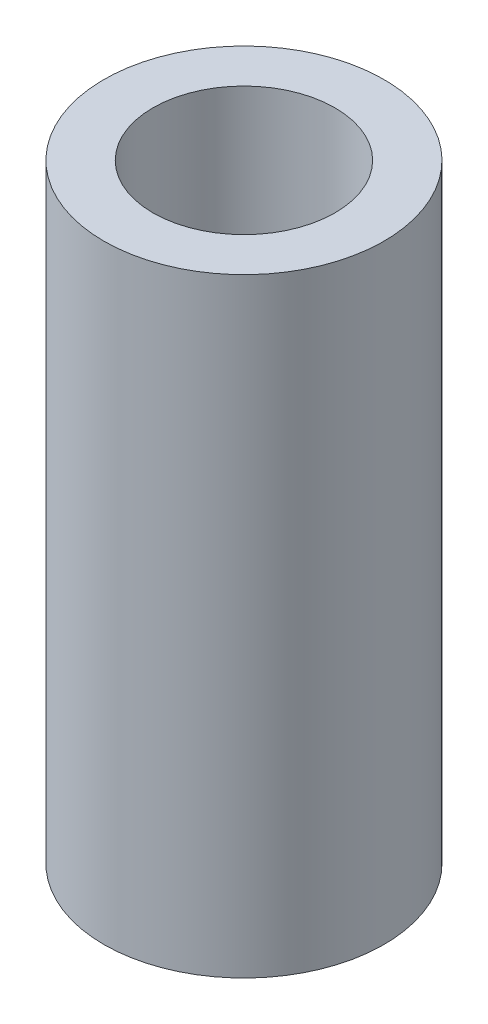
ISO-10303-21;
HEADER;
FILE_DESCRIPTION(('STEP AP214'),'2;1');
FILE_NAME('part.step','',(''),(''),'','','');
FILE_SCHEMA(('AUTOMOTIVE_DESIGN { 1 0 10303 214 1 1 1 1 }'));
ENDSEC;
DATA;
#1=APPLICATION_CONTEXT('core data for automotive mechanical design processes');
#2=APPLICATION_PROTOCOL_DEFINITION('international standard','automotive_design',2000,#1);
#3=PRODUCT_CONTEXT('',#1,'mechanical');
#4=PRODUCT('Part','Part','',(#3));
#5=PRODUCT_RELATED_PRODUCT_CATEGORY('part','',(#4));
#6=PRODUCT_DEFINITION_FORMATION('','',#4);
#7=PRODUCT_DEFINITION_CONTEXT('part definition',#1,'design');
#8=PRODUCT_DEFINITION('design','',#6,#7);
#9=PRODUCT_DEFINITION_SHAPE('','',#8);
#10=(LENGTH_UNIT() NAMED_UNIT(*) SI_UNIT(.MILLI.,.METRE.));
#11=(NAMED_UNIT(*) PLANE_ANGLE_UNIT() SI_UNIT($,.RADIAN.));
#12=(NAMED_UNIT(*) SI_UNIT($,.STERADIAN.) SOLID_ANGLE_UNIT());
#13=UNCERTAINTY_MEASURE_WITH_UNIT(LENGTH_MEASURE(1.E-05),#10,'distance_accuracy_value','');
#14=(GEOMETRIC_REPRESENTATION_CONTEXT(3) GLOBAL_UNCERTAINTY_ASSIGNED_CONTEXT((#13)) GLOBAL_UNIT_ASSIGNED_CONTEXT((#10,
#11,#12)) REPRESENTATION_CONTEXT('',''));
#15=CARTESIAN_POINT('',(0.,0.,0.));
#16=DIRECTION('',(0.,0.,1.));
#17=DIRECTION('',(1.,0.,0.));
#18=AXIS2_PLACEMENT_3D('',#15,#16,#17);
#19=CARTESIAN_POINT('',(0.,11.049,0.));
#20=DIRECTION('',(0.,1.,0.));
#21=DIRECTION('',(0.,0.,1.));
#22=AXIS2_PLACEMENT_3D('',#19,#20,#21);
#23=PLANE('',#22);
#24=CARTESIAN_POINT('',(0.,11.049,0.));
#25=DIRECTION('',(0.,1.,0.));
#26=DIRECTION('',(0.,0.,1.));
#27=AXIS2_PLACEMENT_3D('',#24,#25,#26);
#28=CIRCLE('',#27,2.54);
#29=CARTESIAN_POINT('',(0.,11.049,2.54));
#30=VERTEX_POINT('',#29);
#31=EDGE_CURVE('E10',#30,#30,#28,.T.);
#32=ORIENTED_EDGE('',*,*,#31,.T.);
#33=EDGE_LOOP('',(#32));
#34=FACE_BOUND('',#33,.T.);
#35=CARTESIAN_POINT('',(0.,11.049,0.));
#36=DIRECTION('',(0.,1.,0.));
#37=DIRECTION('',(0.,0.,1.));
#38=AXIS2_PLACEMENT_3D('',#35,#36,#37);
#39=CIRCLE('',#38,1.651);
#40=CARTESIAN_POINT('',(0.,11.049,1.651));
#41=VERTEX_POINT('',#40);
#42=EDGE_CURVE('E48',#41,#41,#39,.T.);
#43=ORIENTED_EDGE('',*,*,#42,.F.);
#44=EDGE_LOOP('',(#43));
#45=FACE_BOUND('',#44,.T.);
#46=ADVANCED_FACE('F37',(#34,#45),#23,.T.);
#47=CARTESIAN_POINT('',(0.,0.,0.));
#48=DIRECTION('',(0.,1.,0.));
#49=DIRECTION('',(0.,0.,1.));
#50=AXIS2_PLACEMENT_3D('',#47,#48,#49);
#51=PLANE('',#50);
#52=CARTESIAN_POINT('',(0.,0.,0.));
#53=DIRECTION('',(0.,1.,0.));
#54=DIRECTION('',(0.,0.,1.));
#55=AXIS2_PLACEMENT_3D('',#52,#53,#54);
#56=CIRCLE('',#55,2.54);
#57=CARTESIAN_POINT('',(0.,0.,2.54));
#58=VERTEX_POINT('',#57);
#59=EDGE_CURVE('E41',#58,#58,#56,.T.);
#60=ORIENTED_EDGE('',*,*,#59,.F.);
#61=EDGE_LOOP('',(#60));
#62=FACE_BOUND('',#61,.T.);
#63=CARTESIAN_POINT('',(0.,0.,0.));
#64=DIRECTION('',(0.,1.,0.));
#65=DIRECTION('',(0.,0.,1.));
#66=AXIS2_PLACEMENT_3D('',#63,#64,#65);
#67=CIRCLE('',#66,1.651);
#68=CARTESIAN_POINT('',(0.,0.,1.651));
#69=VERTEX_POINT('',#68);
#70=EDGE_CURVE('E50',#69,#69,#67,.T.);
#71=ORIENTED_EDGE('',*,*,#70,.T.);
#72=EDGE_LOOP('',(#71));
#73=FACE_BOUND('',#72,.T.);
#74=ADVANCED_FACE('F60',(#62,#73),#51,.F.);
#75=CARTESIAN_POINT('',(0.,11.049,0.));
#76=DIRECTION('',(0.,-1.,0.));
#77=DIRECTION('',(0.,0.,-1.));
#78=AXIS2_PLACEMENT_3D('',#75,#76,#77);
#79=CYLINDRICAL_SURFACE('',#78,2.54);
#80=ORIENTED_EDGE('',*,*,#31,.F.);
#81=EDGE_LOOP('',(#80));
#82=FACE_BOUND('',#81,.T.);
#83=ORIENTED_EDGE('',*,*,#59,.T.);
#84=EDGE_LOOP('',(#83));
#85=FACE_BOUND('',#84,.T.);
#86=ADVANCED_FACE('F39',(#82,#85),#79,.T.);
#87=CARTESIAN_POINT('',(0.,11.049,0.));
#88=DIRECTION('',(0.,-1.,0.));
#89=DIRECTION('',(0.,0.,-1.));
#90=AXIS2_PLACEMENT_3D('',#87,#88,#89);
#91=CYLINDRICAL_SURFACE('',#90,1.651);
#92=ORIENTED_EDGE('',*,*,#42,.T.);
#93=EDGE_LOOP('',(#92));
#94=FACE_BOUND('',#93,.T.);
#95=ORIENTED_EDGE('',*,*,#70,.F.);
#96=EDGE_LOOP('',(#95));
#97=FACE_BOUND('',#96,.T.);
#98=ADVANCED_FACE('F56',(#94,#97),#91,.F.);
#99=CLOSED_SHELL('',(#46,#74,#86,#98));
#100=MANIFOLD_SOLID_BREP('B2',#99);
#101=ADVANCED_BREP_SHAPE_REPRESENTATION('',(#18,#100),#14);
#102=SHAPE_DEFINITION_REPRESENTATION(#9,#101);
ENDSEC;
END-ISO-10303-21;
